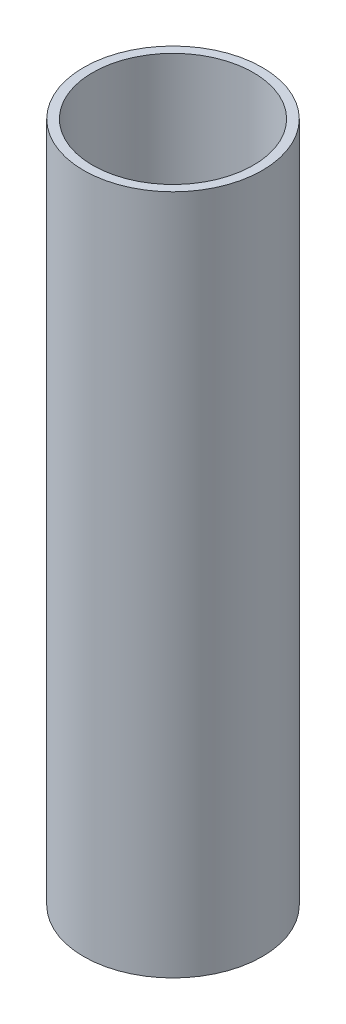
ISO-10303-21;
HEADER;
FILE_DESCRIPTION(('STEP AP214'),'2;1');
FILE_NAME('part.step','',(''),(''),'','','');
FILE_SCHEMA(('AUTOMOTIVE_DESIGN { 1 0 10303 214 1 1 1 1 }'));
ENDSEC;
DATA;
#1=APPLICATION_CONTEXT('core data for automotive mechanical design processes');
#2=APPLICATION_PROTOCOL_DEFINITION('international standard','automotive_design',2000,#1);
#3=PRODUCT_CONTEXT('',#1,'mechanical');
#4=PRODUCT('Part','Part','',(#3));
#5=PRODUCT_RELATED_PRODUCT_CATEGORY('part','',(#4));
#6=PRODUCT_DEFINITION_FORMATION('','',#4);
#7=PRODUCT_DEFINITION_CONTEXT('part definition',#1,'design');
#8=PRODUCT_DEFINITION('design','',#6,#7);
#9=PRODUCT_DEFINITION_SHAPE('','',#8);
#10=(LENGTH_UNIT() NAMED_UNIT(*) SI_UNIT(.MILLI.,.METRE.));
#11=(NAMED_UNIT(*) PLANE_ANGLE_UNIT() SI_UNIT($,.RADIAN.));
#12=(NAMED_UNIT(*) SI_UNIT($,.STERADIAN.) SOLID_ANGLE_UNIT());
#13=UNCERTAINTY_MEASURE_WITH_UNIT(LENGTH_MEASURE(1.E-05),#10,'distance_accuracy_value','');
#14=(GEOMETRIC_REPRESENTATION_CONTEXT(3) GLOBAL_UNCERTAINTY_ASSIGNED_CONTEXT((#13)) GLOBAL_UNIT_ASSIGNED_CONTEXT((#10,
#11,#12)) REPRESENTATION_CONTEXT('',''));
#15=CARTESIAN_POINT('',(0.,0.,0.));
#16=DIRECTION('',(0.,0.,1.));
#17=DIRECTION('',(1.,0.,0.));
#18=AXIS2_PLACEMENT_3D('',#15,#16,#17);
#19=CARTESIAN_POINT('',(0.,152.5,0.));
#20=DIRECTION('',(0.,1.,0.));
#21=DIRECTION('',(0.,0.,1.));
#22=AXIS2_PLACEMENT_3D('',#19,#20,#21);
#23=PLANE('',#22);
#24=CARTESIAN_POINT('',(0.,152.5,0.));
#25=DIRECTION('',(0.,1.,0.));
#26=DIRECTION('',(0.,0.,1.));
#27=AXIS2_PLACEMENT_3D('',#24,#25,#26);
#28=CIRCLE('',#27,20.);
#29=CARTESIAN_POINT('',(0.,152.5,20.));
#30=VERTEX_POINT('',#29);
#31=EDGE_CURVE('E10',#30,#30,#28,.T.);
#32=ORIENTED_EDGE('',*,*,#31,.T.);
#33=EDGE_LOOP('',(#32));
#34=FACE_BOUND('',#33,.T.);
#35=CARTESIAN_POINT('',(0.,152.5,0.));
#36=DIRECTION('',(0.,1.,0.));
#37=DIRECTION('',(0.,0.,1.));
#38=AXIS2_PLACEMENT_3D('',#35,#36,#37);
#39=CIRCLE('',#38,18.);
#40=CARTESIAN_POINT('',(0.,152.5,18.));
#41=VERTEX_POINT('',#40);
#42=EDGE_CURVE('E48',#41,#41,#39,.T.);
#43=ORIENTED_EDGE('',*,*,#42,.F.);
#44=EDGE_LOOP('',(#43));
#45=FACE_BOUND('',#44,.T.);
#46=ADVANCED_FACE('F37',(#34,#45),#23,.T.);
#47=CARTESIAN_POINT('',(0.,0.,0.));
#48=DIRECTION('',(0.,1.,0.));
#49=DIRECTION('',(0.,0.,1.));
#50=AXIS2_PLACEMENT_3D('',#47,#48,#49);
#51=PLANE('',#50);
#52=CARTESIAN_POINT('',(0.,0.,0.));
#53=DIRECTION('',(0.,1.,0.));
#54=DIRECTION('',(0.,0.,1.));
#55=AXIS2_PLACEMENT_3D('',#52,#53,#54);
#56=CIRCLE('',#55,20.);
#57=CARTESIAN_POINT('',(0.,0.,20.));
#58=VERTEX_POINT('',#57);
#59=EDGE_CURVE('E41',#58,#58,#56,.T.);
#60=ORIENTED_EDGE('',*,*,#59,.F.);
#61=EDGE_LOOP('',(#60));
#62=FACE_BOUND('',#61,.T.);
#63=CARTESIAN_POINT('',(0.,0.,0.));
#64=DIRECTION('',(0.,1.,0.));
#65=DIRECTION('',(0.,0.,1.));
#66=AXIS2_PLACEMENT_3D('',#63,#64,#65);
#67=CIRCLE('',#66,18.);
#68=CARTESIAN_POINT('',(0.,0.,18.));
#69=VERTEX_POINT('',#68);
#70=EDGE_CURVE('E50',#69,#69,#67,.T.);
#71=ORIENTED_EDGE('',*,*,#70,.T.);
#72=EDGE_LOOP('',(#71));
#73=FACE_BOUND('',#72,.T.);
#74=ADVANCED_FACE('F60',(#62,#73),#51,.F.);
#75=CARTESIAN_POINT('',(0.,152.5,0.));
#76=DIRECTION('',(0.,-1.,0.));
#77=DIRECTION('',(0.,0.,-1.));
#78=AXIS2_PLACEMENT_3D('',#75,#76,#77);
#79=CYLINDRICAL_SURFACE('',#78,20.);
#80=ORIENTED_EDGE('',*,*,#31,.F.);
#81=EDGE_LOOP('',(#80));
#82=FACE_BOUND('',#81,.T.);
#83=ORIENTED_EDGE('',*,*,#59,.T.);
#84=EDGE_LOOP('',(#83));
#85=FACE_BOUND('',#84,.T.);
#86=ADVANCED_FACE('F39',(#82,#85),#79,.T.);
#87=CARTESIAN_POINT('',(0.,152.5,0.));
#88=DIRECTION('',(0.,-1.,0.));
#89=DIRECTION('',(0.,0.,-1.));
#90=AXIS2_PLACEMENT_3D('',#87,#88,#89);
#91=CYLINDRICAL_SURFACE('',#90,18.);
#92=ORIENTED_EDGE('',*,*,#42,.T.);
#93=EDGE_LOOP('',(#92));
#94=FACE_BOUND('',#93,.T.);
#95=ORIENTED_EDGE('',*,*,#70,.F.);
#96=EDGE_LOOP('',(#95));
#97=FACE_BOUND('',#96,.T.);
#98=ADVANCED_FACE('F56',(#94,#97),#91,.F.);
#99=CLOSED_SHELL('',(#46,#74,#86,#98));
#100=MANIFOLD_SOLID_BREP('B2',#99);
#101=ADVANCED_BREP_SHAPE_REPRESENTATION('',(#18,#100),#14);
#102=SHAPE_DEFINITION_REPRESENTATION(#9,#101);
ENDSEC;
END-ISO-10303-21;
